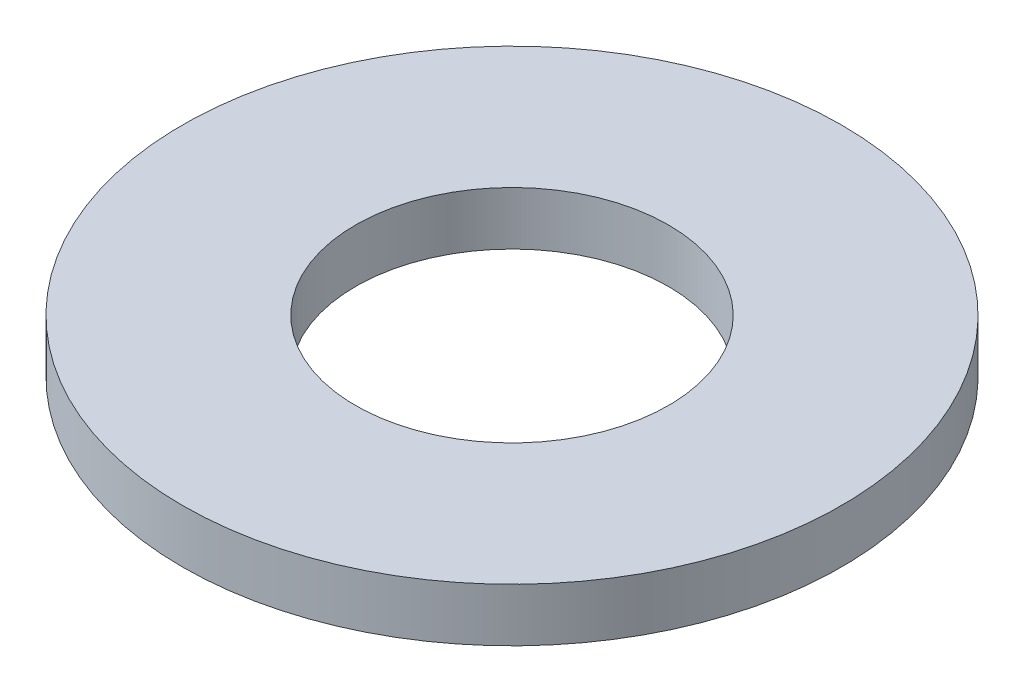
ISO-10303-21;
HEADER;
FILE_DESCRIPTION(('STEP AP214'),'2;1');
FILE_NAME('part.step','',(''),(''),'','','');
FILE_SCHEMA(('AUTOMOTIVE_DESIGN { 1 0 10303 214 1 1 1 1 }'));
ENDSEC;
DATA;
#1=APPLICATION_CONTEXT('core data for automotive mechanical design processes');
#2=APPLICATION_PROTOCOL_DEFINITION('international standard','automotive_design',2000,#1);
#3=PRODUCT_CONTEXT('',#1,'mechanical');
#4=PRODUCT('Part','Part','',(#3));
#5=PRODUCT_RELATED_PRODUCT_CATEGORY('part','',(#4));
#6=PRODUCT_DEFINITION_FORMATION('','',#4);
#7=PRODUCT_DEFINITION_CONTEXT('part definition',#1,'design');
#8=PRODUCT_DEFINITION('design','',#6,#7);
#9=PRODUCT_DEFINITION_SHAPE('','',#8);
#10=(LENGTH_UNIT() NAMED_UNIT(*) SI_UNIT(.MILLI.,.METRE.));
#11=(NAMED_UNIT(*) PLANE_ANGLE_UNIT() SI_UNIT($,.RADIAN.));
#12=(NAMED_UNIT(*) SI_UNIT($,.STERADIAN.) SOLID_ANGLE_UNIT());
#13=UNCERTAINTY_MEASURE_WITH_UNIT(LENGTH_MEASURE(1.E-05),#10,'distance_accuracy_value','');
#14=(GEOMETRIC_REPRESENTATION_CONTEXT(3) GLOBAL_UNCERTAINTY_ASSIGNED_CONTEXT((#13)) GLOBAL_UNIT_ASSIGNED_CONTEXT((#10,
#11,#12)) REPRESENTATION_CONTEXT('',''));
#15=CARTESIAN_POINT('',(0.,0.,0.));
#16=DIRECTION('',(0.,0.,1.));
#17=DIRECTION('',(1.,0.,0.));
#18=AXIS2_PLACEMENT_3D('',#15,#16,#17);
#19=CARTESIAN_POINT('',(0.,2.,0.));
#20=DIRECTION('',(0.,-1.,0.));
#21=DIRECTION('',(0.,0.,-1.));
#22=AXIS2_PLACEMENT_3D('',#19,#20,#21);
#23=CYLINDRICAL_SURFACE('',#22,12.36);
#24=CARTESIAN_POINT('',(0.,2.,0.));
#25=DIRECTION('',(0.,1.,0.));
#26=DIRECTION('',(0.,0.,1.));
#27=AXIS2_PLACEMENT_3D('',#24,#25,#26);
#28=CIRCLE('',#27,12.36);
#29=CARTESIAN_POINT('',(0.,2.,12.36));
#30=VERTEX_POINT('',#29);
#31=EDGE_CURVE('E10',#30,#30,#28,.T.);
#32=ORIENTED_EDGE('',*,*,#31,.F.);
#33=EDGE_LOOP('',(#32));
#34=FACE_BOUND('',#33,.T.);
#35=CARTESIAN_POINT('',(0.,0.,0.));
#36=DIRECTION('',(0.,1.,0.));
#37=DIRECTION('',(0.,0.,1.));
#38=AXIS2_PLACEMENT_3D('',#35,#36,#37);
#39=CIRCLE('',#38,12.36);
#40=CARTESIAN_POINT('',(0.,0.,12.36));
#41=VERTEX_POINT('',#40);
#42=EDGE_CURVE('E46',#41,#41,#39,.T.);
#43=ORIENTED_EDGE('',*,*,#42,.T.);
#44=EDGE_LOOP('',(#43));
#45=FACE_BOUND('',#44,.T.);
#46=ADVANCED_FACE('F43',(#34,#45),#23,.T.);
#47=CARTESIAN_POINT('',(0.,2.,0.));
#48=DIRECTION('',(0.,1.,0.));
#49=DIRECTION('',(0.,0.,1.));
#50=AXIS2_PLACEMENT_3D('',#47,#48,#49);
#51=PLANE('',#50);
#52=CARTESIAN_POINT('',(0.,2.,0.));
#53=DIRECTION('',(0.,-1.,0.));
#54=DIRECTION('',(0.,0.,-1.));
#55=AXIS2_PLACEMENT_3D('',#52,#53,#54);
#56=CIRCLE('',#55,5.8674);
#57=CARTESIAN_POINT('',(0.,2.,-5.8674));
#58=VERTEX_POINT('',#57);
#59=EDGE_CURVE('E55',#58,#58,#56,.T.);
#60=ORIENTED_EDGE('',*,*,#59,.T.);
#61=EDGE_LOOP('',(#60));
#62=FACE_BOUND('',#61,.T.);
#63=ORIENTED_EDGE('',*,*,#31,.T.);
#64=EDGE_LOOP('',(#63));
#65=FACE_BOUND('',#64,.T.);
#66=ADVANCED_FACE('F65',(#62,#65),#51,.T.);
#67=CARTESIAN_POINT('',(0.,0.,0.));
#68=DIRECTION('',(0.,1.,0.));
#69=DIRECTION('',(0.,0.,1.));
#70=AXIS2_PLACEMENT_3D('',#67,#68,#69);
#71=PLANE('',#70);
#72=CARTESIAN_POINT('',(0.,0.,0.));
#73=DIRECTION('',(0.,-1.,0.));
#74=DIRECTION('',(0.,0.,-1.));
#75=AXIS2_PLACEMENT_3D('',#72,#73,#74);
#76=CIRCLE('',#75,5.8674);
#77=CARTESIAN_POINT('',(0.,0.,-5.8674));
#78=VERTEX_POINT('',#77);
#79=EDGE_CURVE('E57',#78,#78,#76,.T.);
#80=ORIENTED_EDGE('',*,*,#79,.F.);
#81=EDGE_LOOP('',(#80));
#82=FACE_BOUND('',#81,.T.);
#83=ORIENTED_EDGE('',*,*,#42,.F.);
#84=EDGE_LOOP('',(#83));
#85=FACE_BOUND('',#84,.T.);
#86=ADVANCED_FACE('F70',(#82,#85),#71,.F.);
#87=CARTESIAN_POINT('',(0.,2.,0.));
#88=DIRECTION('',(0.,-1.,0.));
#89=DIRECTION('',(0.,0.,-1.));
#90=AXIS2_PLACEMENT_3D('',#87,#88,#89);
#91=CYLINDRICAL_SURFACE('',#90,5.8674);
#92=ORIENTED_EDGE('',*,*,#59,.F.);
#93=EDGE_LOOP('',(#92));
#94=FACE_BOUND('',#93,.T.);
#95=ORIENTED_EDGE('',*,*,#79,.T.);
#96=EDGE_LOOP('',(#95));
#97=FACE_BOUND('',#96,.T.);
#98=ADVANCED_FACE('F67',(#94,#97),#91,.F.);
#99=CLOSED_SHELL('',(#46,#66,#86,#98));
#100=MANIFOLD_SOLID_BREP('B2',#99);
#101=ADVANCED_BREP_SHAPE_REPRESENTATION('',(#18,#100),#14);
#102=SHAPE_DEFINITION_REPRESENTATION(#9,#101);
ENDSEC;
END-ISO-10303-21;
